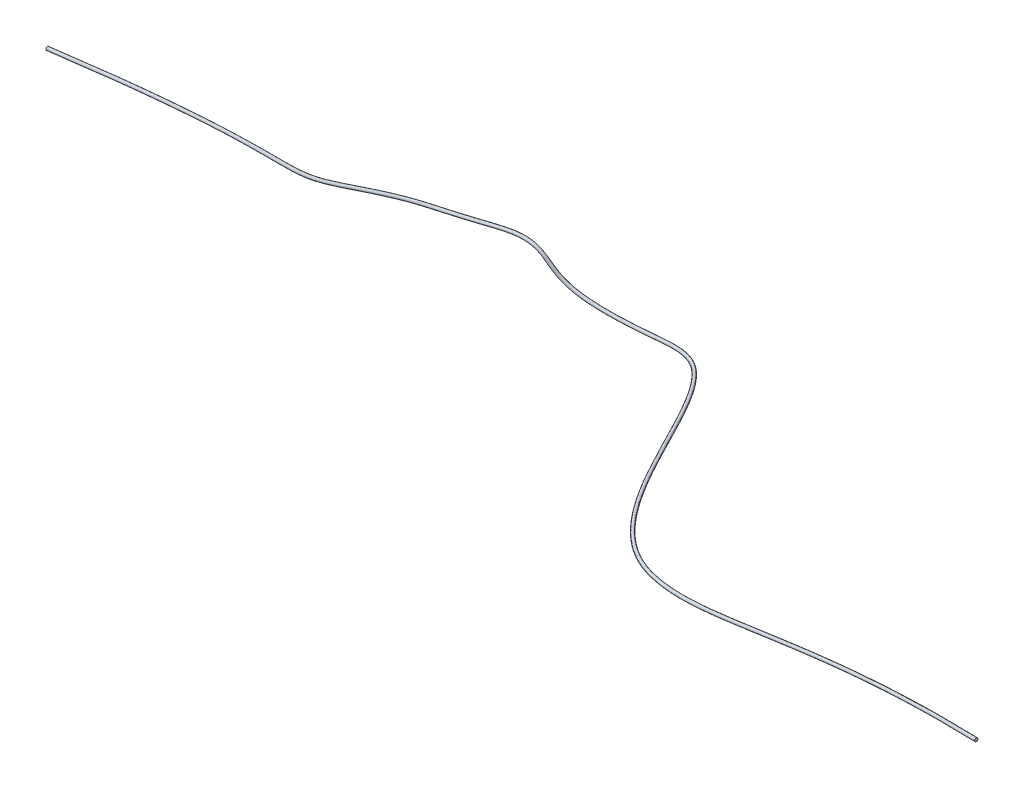
ISO-10303-21;
HEADER;
FILE_DESCRIPTION(('STEP AP214'),'2;1');
FILE_NAME('part.step','',(''),(''),'','','');
FILE_SCHEMA(('AUTOMOTIVE_DESIGN { 1 0 10303 214 1 1 1 1 }'));
ENDSEC;
DATA;
#1=APPLICATION_CONTEXT('core data for automotive mechanical design processes');
#2=APPLICATION_PROTOCOL_DEFINITION('international standard','automotive_design',2000,#1);
#3=PRODUCT_CONTEXT('',#1,'mechanical');
#4=PRODUCT('Part','Part','',(#3));
#5=PRODUCT_RELATED_PRODUCT_CATEGORY('part','',(#4));
#6=PRODUCT_DEFINITION_FORMATION('','',#4);
#7=PRODUCT_DEFINITION_CONTEXT('part definition',#1,'design');
#8=PRODUCT_DEFINITION('design','',#6,#7);
#9=PRODUCT_DEFINITION_SHAPE('','',#8);
#10=(LENGTH_UNIT() NAMED_UNIT(*) SI_UNIT(.MILLI.,.METRE.));
#11=(NAMED_UNIT(*) PLANE_ANGLE_UNIT() SI_UNIT($,.RADIAN.));
#12=(NAMED_UNIT(*) SI_UNIT($,.STERADIAN.) SOLID_ANGLE_UNIT());
#13=UNCERTAINTY_MEASURE_WITH_UNIT(LENGTH_MEASURE(1.E-05),#10,'distance_accuracy_value','');
#14=(GEOMETRIC_REPRESENTATION_CONTEXT(3) GLOBAL_UNCERTAINTY_ASSIGNED_CONTEXT((#13)) GLOBAL_UNIT_ASSIGNED_CONTEXT((#10,
#11,#12)) REPRESENTATION_CONTEXT('',''));
#15=CARTESIAN_POINT('',(0.,0.,0.));
#16=DIRECTION('',(0.,0.,1.));
#17=DIRECTION('',(1.,0.,0.));
#18=AXIS2_PLACEMENT_3D('',#15,#16,#17);
#19=CARTESIAN_POINT('',(0.0577607720607765,0.,0.243235879777106));
#20=DIRECTION('',(-0.970136098896678,0.0759121653718737,0.230376415385968));
#21=DIRECTION('',(0.231043088243106,0.,0.972943519108426));
#22=AXIS2_PLACEMENT_3D('',#19,#20,#21);
#23=PLANE('',#22);
#24=CARTESIAN_POINT('',(0.,0.,0.));
#25=DIRECTION('',(0.970136098896678,-0.0759121653718736,-0.230376415385968));
#26=DIRECTION('',(-0.231043088243106,0.,-0.972943519108426));
#27=AXIS2_PLACEMENT_3D('',#24,#25,#26);
#28=CIRCLE('',#27,0.25);
#29=CARTESIAN_POINT('',(-0.0577607720607765,0.,-0.243235879777106));
#30=VERTEX_POINT('',#29);
#31=EDGE_CURVE('E51',#30,#30,#28,.T.);
#32=ORIENTED_EDGE('',*,*,#31,.F.);
#33=EDGE_LOOP('',(#32));
#34=FACE_BOUND('',#33,.T.);
#35=ADVANCED_FACE('F47',(#34),#23,.T.);
#36=CARTESIAN_POINT('',(153.394156132668,-10.9843707983072,10.0933429930186));
#37=DIRECTION('',(-0.997897441630285,-0.0279046735619622,-0.058498078439647));
#38=DIRECTION('',(-0.0585208671221338,0.,0.998286185475525));
#39=AXIS2_PLACEMENT_3D('',#36,#37,#38);
#40=PLANE('',#39);
#41=CARTESIAN_POINT('',(153.395649871753,-10.7695909772429,9.9654078641168));
#42=DIRECTION('',(-0.997897441630286,-0.0279046735619622,-0.058498078439647));
#43=DIRECTION('',(-0.0585208671221338,0.,0.998286185475525));
#44=AXIS2_PLACEMENT_3D('',#41,#42,#43);
#45=CIRCLE('',#44,0.25);
#46=CARTESIAN_POINT('',(153.381019654973,-10.7695909772429,10.2149794104857));
#47=VERTEX_POINT('',#46);
#48=EDGE_CURVE('E11',#47,#47,#45,.T.);
#49=ORIENTED_EDGE('',*,*,#48,.F.);
#50=EDGE_LOOP('',(#49));
#51=FACE_BOUND('',#50,.T.);
#52=ADVANCED_FACE('F49',(#51),#40,.F.);
#53=CARTESIAN_POINT('',(-0.0577607720607765,0.,-0.243235879777106));
#54=CARTESIAN_POINT('',(6.45878838175014,-0.499880363927215,-1.79247331755684));
#55=CARTESIAN_POINT('',(16.6014105210175,-1.4942979671369,-4.11833407375674));
#56=CARTESIAN_POINT('',(28.3462962653859,-3.20738886149051,-6.60727280442785));
#57=CARTESIAN_POINT('',(30.8896640583218,-4.37760306911311,-7.31804389045089));
#58=CARTESIAN_POINT('',(34.0446964993133,-5.09036778912606,-8.94653199280111));
#59=CARTESIAN_POINT('',(36.1650490490448,-5.24438026406108,-10.2702513566765));
#60=CARTESIAN_POINT('',(39.2746408392147,-5.55407273055444,-12.2766585762137));
#61=CARTESIAN_POINT('',(41.2572454666078,-5.8588438783671,-13.6121514200171));
#62=CARTESIAN_POINT('',(43.2102682108326,-6.25924652844076,-14.7063108795634));
#63=CARTESIAN_POINT('',(45.1528286886776,-6.35388971310932,-15.3568873537207));
#64=CARTESIAN_POINT('',(47.6894249034441,-6.28745458005761,-15.9017421175981));
#65=CARTESIAN_POINT('',(50.7098420193957,-5.97348610860436,-16.4302418337879));
#66=CARTESIAN_POINT('',(53.3697320747002,-5.6317697446533,-16.8744872664419));
#67=CARTESIAN_POINT('',(54.8163472302238,-5.55484120893506,-17.1227292851218));
#68=CARTESIAN_POINT('',(55.5492919594778,-5.57068267741669,-17.2521859084911));
#69=CARTESIAN_POINT('',(56.2165447277572,-5.63177275142349,-17.3734458187258));
#70=CARTESIAN_POINT('',(56.9273168969393,-5.77938771716405,-17.5090516336717));
#71=CARTESIAN_POINT('',(58.296946253723,-6.32918840296866,-17.7955234538064));
#72=CARTESIAN_POINT('',(59.0201348638921,-7.01735091959234,-17.9733051072205));
#73=CARTESIAN_POINT('',(59.7736054025902,-7.92924128723453,-18.2188891721859));
#74=CARTESIAN_POINT('',(60.0876179032983,-8.40563195598929,-18.3543644532404));
#75=CARTESIAN_POINT('',(60.7945416240185,-9.28195255302844,-18.6388394188896));
#76=CARTESIAN_POINT('',(61.5887183944627,-9.9789640420526,-18.9116887598417));
#77=CARTESIAN_POINT('',(62.8938183455601,-10.7504319710075,-19.3013655331489));
#78=CARTESIAN_POINT('',(64.2700599577064,-11.293194804197,-19.641761122574));
#79=CARTESIAN_POINT('',(66.0348309176362,-11.7461142915373,-20.0061816016343));
#80=CARTESIAN_POINT('',(68.0872049885255,-12.0659636977657,-20.3597642613271));
#81=CARTESIAN_POINT('',(70.36135576753,-12.2728002645725,-20.6973154530245));
#82=CARTESIAN_POINT('',(72.0794634066687,-12.3525541234051,-20.9192929471287));
#83=CARTESIAN_POINT('',(73.8279904245098,-12.4019162983079,-21.1360497121873));
#84=CARTESIAN_POINT('',(75.7108027186144,-12.4276067737056,-21.3590996444943));
#85=CARTESIAN_POINT('',(77.8428262239037,-12.4188392947474,-21.1177971314962));
#86=CARTESIAN_POINT('',(79.2187743945239,-12.427873868258,-20.4724205352061));
#87=CARTESIAN_POINT('',(80.0473548263788,-12.4368346122433,-19.9545909737948));
#88=CARTESIAN_POINT('',(80.9774296433403,-12.4516525699776,-19.1745644464751));
#89=CARTESIAN_POINT('',(82.1202801532077,-12.4775310605994,-17.8750745489771));
#90=CARTESIAN_POINT('',(83.2258707428155,-12.5095610303557,-16.3199356362156));
#91=CARTESIAN_POINT('',(85.3648864588628,-12.5827605215081,-12.8201746809854));
#92=CARTESIAN_POINT('',(88.1617965365295,-12.7114168544118,-7.0120070290527));
#93=CARTESIAN_POINT('',(92.1185024203641,-12.8795127139677,0.453457506541938));
#94=CARTESIAN_POINT('',(95.728710076884,-12.9963895139614,5.39531558279754));
#95=CARTESIAN_POINT('',(98.5298877799888,-13.0658346643746,7.77966077833291));
#96=CARTESIAN_POINT('',(100.717005140519,-13.0998956040668,9.18852422052815));
#97=CARTESIAN_POINT('',(102.1482411717,-13.1079848532039,9.84539709226093));
#98=CARTESIAN_POINT('',(103.534201907112,-13.1118050644943,10.2278279845731));
#99=CARTESIAN_POINT('',(104.682073977787,-13.1116806833564,10.5226820559079));
#100=CARTESIAN_POINT('',(106.250232434624,-13.0947710404488,10.8122249158094));
#101=CARTESIAN_POINT('',(110.785523481581,-12.9547888571745,11.2430250245779));
#102=CARTESIAN_POINT('',(118.161636066218,-12.4498364933321,10.7402651630797));
#103=CARTESIAN_POINT('',(132.180940740219,-11.3961399897559,9.45946671396623));
#104=CARTESIAN_POINT('',(145.446438004091,-10.775618418438,9.37464986046103));
#105=CARTESIAN_POINT('',(153.397143610838,-10.5548111561785,9.83747273521505));
#106=CARTESIAN_POINT('',(-0.0208316474007508,0.498557254271902,-0.252005370338476));
#107=CARTESIAN_POINT('',(6.50698194476197,0.00157248403255344,-1.78354020257608));
#108=CARTESIAN_POINT('',(16.6721329607329,-0.987053931801395,-4.0739957476917));
#109=CARTESIAN_POINT('',(28.5063508339026,-2.83827977955314,-6.25224359148855));
#110=CARTESIAN_POINT('',(31.0905513470382,-3.98165262749174,-7.08055984388006));
#111=CARTESIAN_POINT('',(34.2472458082991,-4.67917498832223,-8.75295047635303));
#112=CARTESIAN_POINT('',(36.3544988198394,-4.83074384757825,-10.0695238778762));
#113=CARTESIAN_POINT('',(39.4641980997049,-5.1532407726434,-12.040698670839));
#114=CARTESIAN_POINT('',(41.5034994921079,-5.49498790779137,-13.334278276667));
#115=CARTESIAN_POINT('',(43.2862032788121,-5.76065392062704,-14.6191806237963));
#116=CARTESIAN_POINT('',(45.1535297457526,-5.85510196312535,-15.290534123693));
#117=CARTESIAN_POINT('',(47.6367908131393,-5.79307763174764,-15.9746210908507));
#118=CARTESIAN_POINT('',(50.6264209823539,-5.48249200490796,-16.5008009996913));
#119=CARTESIAN_POINT('',(53.309516094615,-5.13852093652436,-16.9305168924285));
#120=CARTESIAN_POINT('',(54.7937319727913,-5.0576655351797,-17.1763659314035));
#121=CARTESIAN_POINT('',(55.5659005775007,-5.07410046407564,-17.3109986017893));
#122=CARTESIAN_POINT('',(56.2796092855287,-5.13898050540637,-17.4386725314738));
#123=CARTESIAN_POINT('',(57.053550517321,-5.29910543898317,-17.5798177814674));
#124=CARTESIAN_POINT('',(58.5792925342405,-5.90453935902592,-17.9101678825314));
#125=CARTESIAN_POINT('',(59.3944019505158,-6.71752616796506,-17.8871215365681));
#126=CARTESIAN_POINT('',(60.1949662369332,-7.68496617460601,-18.0470453166935));
#127=CARTESIAN_POINT('',(60.5008239084634,-8.14269852985124,-18.2152182181828));
#128=CARTESIAN_POINT('',(61.1652135340042,-8.98141381142423,-18.5082444599017));
#129=CARTESIAN_POINT('',(61.9068102817557,-9.67654743766845,-18.65623374802));
#130=CARTESIAN_POINT('',(63.1330191921053,-10.4176832844175,-19.0135328084337));
#131=CARTESIAN_POINT('',(64.4505951736625,-10.9526192154016,-19.3209956912816));
#132=CARTESIAN_POINT('',(66.1670039071864,-11.4053587395399,-19.664037339463));
#133=CARTESIAN_POINT('',(68.185805207841,-11.7315778830892,-20.0009212211818));
#134=CARTESIAN_POINT('',(70.4343457605594,-11.9440093592368,-20.3273141360431));
#135=CARTESIAN_POINT('',(72.1433763703359,-12.0341619943383,-20.5394889921646));
#136=CARTESIAN_POINT('',(73.8760042212901,-12.0815135658584,-20.7545307980852));
#137=CARTESIAN_POINT('',(75.7309815446768,-12.0995365226367,-20.9795922290188));
#138=CARTESIAN_POINT('',(77.7478625860792,-12.1220852858153,-20.7172652563948));
#139=CARTESIAN_POINT('',(79.028586182954,-12.1338907597944,-20.1150058514493));
#140=CARTESIAN_POINT('',(79.8051131099414,-12.1428791947165,-19.6283587966575));
#141=CARTESIAN_POINT('',(80.6933732576878,-12.1568253859171,-18.885725326945));
#142=CARTESIAN_POINT('',(81.8040506801766,-12.182302203744,-17.6233065285365));
#143=CARTESIAN_POINT('',(82.8905244036027,-12.2140212874416,-16.095355261276));
#144=CARTESIAN_POINT('',(85.0061680191779,-12.2883415331442,-12.6318866745537));
#145=CARTESIAN_POINT('',(87.8033076598548,-12.413309189577,-6.83277523185717));
#146=CARTESIAN_POINT('',(91.7685084495539,-12.590207256472,0.666813776060485));
#147=CARTESIAN_POINT('',(95.4177189306268,-12.719585006542,5.67429373195811));
#148=CARTESIAN_POINT('',(98.2831819258058,-12.7688078639153,8.10339158496531));
#149=CARTESIAN_POINT('',(100.528239050278,-12.8233451346344,9.56063572259055));
#150=CARTESIAN_POINT('',(102.001664228077,-12.8721143372834,10.2591062597252));
#151=CARTESIAN_POINT('',(103.419815971904,-12.9031657075963,10.6667902237757));
#152=CARTESIAN_POINT('',(104.592923301591,-12.9231866374075,10.9799176533674));
#153=CARTESIAN_POINT('',(106.187259260974,-12.9186618208816,11.2789813054514));
#154=CARTESIAN_POINT('',(110.777226558432,-12.7756053862532,11.7079127438109));
#155=CARTESIAN_POINT('',(118.189902459585,-12.1713377381368,11.1598678711068));
#156=CARTESIAN_POINT('',(132.18741237716,-11.1571655885709,9.89836961634992));
#157=CARTESIAN_POINT('',(145.427082956633,-10.5256222597872,9.80666623012544));
#158=CARTESIAN_POINT('',(153.36487522118,-10.2993041187948,10.2660458385198));
#159=CARTESIAN_POINT('',(0.0946898967208022,0.498557254271902,0.234466389215737));
#160=CARTESIAN_POINT('',(6.62101672438055,-0.0183771685929523,-1.29318612764074));
#161=CARTESIAN_POINT('',(16.7831942113455,-1.04690288967791,-3.5758770419941));
#162=CARTESIAN_POINT('',(28.5041063873947,-3.20807118640788,-5.8651460883077));
#163=CARTESIAN_POINT('',(31.1834722025197,-4.27279655601991,-6.67803163461776));
#164=CARTESIAN_POINT('',(34.4134359014891,-4.94069337051228,-8.36320969365824));
#165=CARTESIAN_POINT('',(36.5481262223797,-5.09746257050476,-9.69722485411572));
#166=CARTESIAN_POINT('',(39.6702191833182,-5.45610840838744,-11.6964984567093));
#167=CARTESIAN_POINT('',(41.6652995941727,-5.85801009591359,-12.9988840019737));
#168=CARTESIAN_POINT('',(43.4800487788455,-5.86727782811666,-14.1580952671061));
#169=CARTESIAN_POINT('',(45.2767826252701,-5.91793696076121,-14.8061476185073));
#170=CARTESIAN_POINT('',(47.7222416134267,-5.71179627077171,-15.4861597683115));
#171=CARTESIAN_POINT('',(50.6985731599576,-5.3995722540804,-16.0110707482726));
#172=CARTESIAN_POINT('',(53.3852578049968,-5.07361876705282,-16.4406581064756));
#173=CARTESIAN_POINT('',(54.8768066931704,-5.00076743880312,-16.6866133903219));
#174=CARTESIAN_POINT('',(55.6565254697505,-5.01924495947971,-16.8222578663802));
#175=CARTESIAN_POINT('',(56.3784456141492,-5.08675169475957,-16.9512725590822));
#176=CARTESIAN_POINT('',(57.1612723348519,-5.25447082012235,-17.0942155209741));
#177=CARTESIAN_POINT('',(58.7309125246338,-5.86798240970445,-17.4276982052854));
#178=CARTESIAN_POINT('',(59.3808241072121,-6.8357414314329,-17.4142440112926));
#179=CARTESIAN_POINT('',(60.1163875901607,-7.87932400814059,-17.5766585392622));
#180=CARTESIAN_POINT('',(60.4546679034375,-8.32155768857565,-17.7419926916508));
#181=CARTESIAN_POINT('',(61.151063792083,-9.16511266751485,-18.0491911964565));
#182=CARTESIAN_POINT('',(61.8306936650667,-9.95330285575019,-18.2406334126173));
#183=CARTESIAN_POINT('',(63.0913064969169,-10.7276088906046,-18.6236685168149));
#184=CARTESIAN_POINT('',(64.4270690657798,-11.2895824883289,-18.9515417683068));
#185=CARTESIAN_POINT('',(66.1630287417702,-11.759506880672,-19.3107696627564));
#186=CARTESIAN_POINT('',(68.1962567619822,-12.0989777918958,-19.6618584393988));
#187=CARTESIAN_POINT('',(70.4536621213247,-12.3195542214462,-19.9974004960891));
#188=CARTESIAN_POINT('',(72.1720508124912,-12.4191588624825,-20.2221231024573));
#189=CARTESIAN_POINT('',(73.9031486757139,-12.4653857557595,-20.4348270098601));
#190=CARTESIAN_POINT('',(75.7436993684409,-12.4773094281727,-20.6505261264043));
#191=CARTESIAN_POINT('',(77.6743754527358,-12.5245834693233,-20.4223704812448));
#192=CARTESIAN_POINT('',(78.8855638632615,-12.538352713749,-19.8576466954933));
#193=CARTESIAN_POINT('',(79.6236765580364,-12.5472792371648,-19.3952482278205));
#194=CARTESIAN_POINT('',(80.4797581534961,-12.5606037470348,-18.6808743462722));
#195=CARTESIAN_POINT('',(81.5665119478495,-12.5857540650881,-17.4469323450565));
#196=CARTESIAN_POINT('',(82.6387581126688,-12.6172321983602,-15.9398698898879));
#197=CARTESIAN_POINT('',(84.7393102896566,-12.6923625248282,-12.505390645674));
#198=CARTESIAN_POINT('',(87.5305624289089,-12.8144505127341,-6.71146814355241));
#199=CARTESIAN_POINT('',(91.5168781305239,-12.9983746042154,0.809673094791617));
#200=CARTESIAN_POINT('',(95.1962714000919,-13.1347298200833,5.84768453431326));
#201=CARTESIAN_POINT('',(98.0998246401613,-13.1728355382683,8.3381662189757));
#202=CARTESIAN_POINT('',(100.394094609285,-13.2392821240691,9.80386033186013));
#203=CARTESIAN_POINT('',(101.913189367636,-13.3113151214055,10.4779795700349));
#204=CARTESIAN_POINT('',(103.363499357098,-13.3570680441747,10.8675027379262));
#205=CARTESIAN_POINT('',(104.56108455058,-13.3877359713463,11.1669121964908));
#206=CARTESIAN_POINT('',(106.175930903007,-13.3882553605801,11.4564175324328));
#207=CARTESIAN_POINT('',(110.803324609548,-13.2396297831443,11.8876424209233));
#208=CARTESIAN_POINT('',(118.254330616854,-12.5896146001403,11.4338770107052));
#209=CARTESIAN_POINT('',(132.225507896473,-11.5947086633453,10.1370996867871));
#210=CARTESIAN_POINT('',(145.437789810958,-10.9578430461311,10.0568230921402));
#211=CARTESIAN_POINT('',(153.361887743011,-10.7288637609235,10.5219160963233));
#212=CARTESIAN_POINT('',(0.0577607720607765,0.,0.243235879777106));
#213=CARTESIAN_POINT('',(6.57282316136871,-0.519830016552721,-1.3021192426215));
#214=CARTESIAN_POINT('',(16.7124717716301,-1.55414692501341,-3.62021536805914));
#215=CARTESIAN_POINT('',(28.344051818878,-3.57718026834524,-6.220175301247));
#216=CARTESIAN_POINT('',(30.9825849138034,-4.66874699764128,-6.91551568118859));
#217=CARTESIAN_POINT('',(34.2108865925033,-5.35188617131611,-8.55679121010632));
#218=CARTESIAN_POINT('',(36.3586764515851,-5.5110989869876,-9.89795233291601));
#219=CARTESIAN_POINT('',(39.4806619228281,-5.85694036629849,-11.9324583620839));
#220=CARTESIAN_POINT('',(41.4190455686726,-6.22186606648931,-13.2767571453237));
#221=CARTESIAN_POINT('',(43.404113710866,-6.36587043593038,-14.2452255228732));
#222=CARTESIAN_POINT('',(45.2760815681951,-6.41672471074519,-14.8725008485351));
#223=CARTESIAN_POINT('',(47.7748757037315,-6.20617321908168,-15.4132807950589));
#224=CARTESIAN_POINT('',(50.7819941969993,-5.89056635777679,-15.9405115823692));
#225=CARTESIAN_POINT('',(53.4454737850819,-5.56686757518176,-16.384628480489));
#226=CARTESIAN_POINT('',(54.8994219506029,-5.49794311255848,-16.6329767440402));
#227=CARTESIAN_POINT('',(55.6399168517276,-5.51582717282076,-16.7634451730821));
#228=CARTESIAN_POINT('',(56.3153810563778,-5.57954394077668,-16.8860458463342));
#229=CARTESIAN_POINT('',(57.0350387144702,-5.73475309830323,-17.0234493731784));
#230=CARTESIAN_POINT('',(58.4485662441163,-6.29263145364719,-17.3130537765604));
#231=CARTESIAN_POINT('',(59.0065570205884,-7.13556618306017,-17.5004275819449));
#232=CARTESIAN_POINT('',(59.6950267558177,-8.12359912076911,-17.7485023947545));
#233=CARTESIAN_POINT('',(60.0414618982724,-8.58449111471371,-17.8811389267084));
#234=CARTESIAN_POINT('',(60.7803918820973,-9.46565140911907,-18.1797861554444));
#235=CARTESIAN_POINT('',(61.5126017777737,-10.2557194601343,-18.4960884244391));
#236=CARTESIAN_POINT('',(62.8521056503716,-11.0603575771947,-18.9115012415301));
#237=CARTESIAN_POINT('',(64.2465338498237,-11.6301580771243,-19.2723071995992));
#238=CARTESIAN_POINT('',(66.03085575222,-12.1002624326693,-19.6529139249277));
#239=CARTESIAN_POINT('',(68.0976565426667,-12.4333636065723,-20.0207014795441));
#240=CARTESIAN_POINT('',(70.3806721282953,-12.6483451267819,-20.3674018130705));
#241=CARTESIAN_POINT('',(72.108137848824,-12.7375509915493,-20.6019270574214));
#242=CARTESIAN_POINT('',(73.8551348789336,-12.785788488209,-20.8163459239622));
#243=CARTESIAN_POINT('',(75.7235205423786,-12.8053796792416,-21.0300335418798));
#244=CARTESIAN_POINT('',(77.7693390905604,-12.8213374782554,-20.8229023563461));
#245=CARTESIAN_POINT('',(79.0757520748314,-12.8323358222125,-20.2150613792501));
#246=CARTESIAN_POINT('',(79.8659182744738,-12.8412346546917,-19.7214804049577));
#247=CARTESIAN_POINT('',(80.7638145391485,-12.8554309310953,-18.9697134658024));
#248=CARTESIAN_POINT('',(81.8827414208807,-12.8809829219435,-17.6987003654971));
#249=CARTESIAN_POINT('',(82.9741044518815,-12.9127719412742,-16.1644502648275));
#250=CARTESIAN_POINT('',(85.0980287293416,-12.9867815131922,-12.6936786521057));
#251=CARTESIAN_POINT('',(87.8890513055836,-13.1125581775688,-6.89069994074795));
#252=CARTESIAN_POINT('',(91.8668721013341,-13.2876800617111,0.59631682527307));
#253=CARTESIAN_POINT('',(95.5072625463491,-13.4115343275026,5.5687063851527));
#254=CARTESIAN_POINT('',(98.3465304943443,-13.4698623387276,8.01443541234329));
#255=CARTESIAN_POINT('',(100.582860699526,-13.5158325935016,9.43174882979773));
#256=CARTESIAN_POINT('',(102.059766311259,-13.5471856373261,10.0642704025706));
#257=CARTESIAN_POINT('',(103.477885292307,-13.5657074010727,10.4285404987236));
#258=CARTESIAN_POINT('',(104.650235226775,-13.5762300172952,10.7096765990314));
#259=CARTESIAN_POINT('',(106.238904076657,-13.5643645801473,10.9896611427907));
#260=CARTESIAN_POINT('',(110.811621532698,-13.4188132540656,11.4227547016903));
#261=CARTESIAN_POINT('',(118.226064223487,-12.8681133553356,11.0142743026781));
#262=CARTESIAN_POINT('',(132.219036259532,-11.8336830645304,9.69819678440344));
#263=CARTESIAN_POINT('',(145.457144858416,-11.207839204782,9.62480672247577));
#264=CARTESIAN_POINT('',(153.394156132668,-10.9843707983072,10.0933429930186));
#265=CARTESIAN_POINT('',(0.0208316474007508,-0.498557254271902,0.252005370338476));
#266=CARTESIAN_POINT('',(6.52462959835688,-1.02128286451249,-1.31105235760227));
#267=CARTESIAN_POINT('',(16.6417493319146,-2.06139096034892,-3.66455369412417));
#268=CARTESIAN_POINT('',(28.1839972503613,-3.94628935028261,-6.57520451418631));
#269=CARTESIAN_POINT('',(30.7816976250871,-5.06469743926266,-7.15299972775942));
#270=CARTESIAN_POINT('',(34.0083372835175,-5.76307897211994,-8.7503727265544));
#271=CARTESIAN_POINT('',(36.1692266807906,-5.92473540347044,-10.0986798117163));
#272=CARTESIAN_POINT('',(39.291104662338,-6.25777232420953,-12.1684182674586));
#273=CARTESIAN_POINT('',(41.1727915431724,-6.58572203706504,-13.5546302886738));
#274=CARTESIAN_POINT('',(43.3281786428865,-6.8644630437441,-14.3323557786403));
#275=CARTESIAN_POINT('',(45.2753805111201,-6.91551246072917,-14.9388540785628));
#276=CARTESIAN_POINT('',(47.8275097940362,-6.70055016739164,-15.3404018218063));
#277=CARTESIAN_POINT('',(50.865415234041,-6.38156046147317,-15.8699524164658));
#278=CARTESIAN_POINT('',(53.5056897651671,-6.0601163833107,-16.3285988545024));
#279=CARTESIAN_POINT('',(54.9220372080354,-5.99511878631384,-16.5793400977584));
#280=CARTESIAN_POINT('',(55.6233082337046,-6.01240938616181,-16.7046324797839));
#281=CARTESIAN_POINT('',(56.2523164986063,-6.0723361867938,-16.8208191335862));
#282=CARTESIAN_POINT('',(56.9088050940884,-6.21503537648411,-16.9526832253827));
#283=CARTESIAN_POINT('',(58.1662199635988,-6.71728049758993,-17.1984093478355));
#284=CARTESIAN_POINT('',(58.6322899339647,-7.43539093468745,-17.5866111525973));
#285=CARTESIAN_POINT('',(59.2736659214746,-8.36787423339762,-17.9203462502468));
#286=CARTESIAN_POINT('',(59.6282558931073,-8.84742454085176,-18.020285161766));
#287=CARTESIAN_POINT('',(60.4097199721116,-9.76619015072328,-18.3103811144322));
#288=CARTESIAN_POINT('',(61.1945098904808,-10.5581360645185,-18.7515434362608));
#289=CARTESIAN_POINT('',(62.6129048038264,-11.3931062637848,-19.1993339662453));
#290=CARTESIAN_POINT('',(64.0659986338675,-11.9707336659197,-19.5930726308916));
#291=CARTESIAN_POINT('',(65.8986827626699,-12.4410179846667,-19.9950581870991));
#292=CARTESIAN_POINT('',(67.9990563233512,-12.7677494212488,-20.3795445196895));
#293=CARTESIAN_POINT('',(70.3076821352659,-12.9771360321176,-20.737403130052));
#294=CARTESIAN_POINT('',(72.0442248851568,-13.0559431206162,-20.9817310123856));
#295=CARTESIAN_POINT('',(73.8071210821532,-13.1061912206586,-21.1978648380642));
#296=CARTESIAN_POINT('',(75.7033417163162,-13.1334499303105,-21.4095409573553));
#297=CARTESIAN_POINT('',(77.8643027283849,-13.1180914871876,-21.2234342314475));
#298=CARTESIAN_POINT('',(79.2659402864013,-13.126318930676,-20.5724760630068));
#299=CARTESIAN_POINT('',(80.1081599909111,-13.1351900722185,-20.047712582095));
#300=CARTESIAN_POINT('',(81.0478709248009,-13.1502581151558,-19.2585525853326));
#301=CARTESIAN_POINT('',(82.1989708939118,-13.1762117787988,-17.9504683859377));
#302=CARTESIAN_POINT('',(83.3094507910943,-13.2083116841883,-16.3890306397671));
#303=CARTESIAN_POINT('',(85.4567471690263,-13.2812005015562,-12.8819666585374));
#304=CARTESIAN_POINT('',(88.2475401822582,-13.4106658424036,-7.06993173794349));
#305=CARTESIAN_POINT('',(92.2168660721444,-13.5769855192069,0.382960555754522));
#306=CARTESIAN_POINT('',(95.8182536926062,-13.688338834922,5.28972823599213));
#307=CARTESIAN_POINT('',(98.5932363485273,-13.7668891391869,7.69070460571089));
#308=CARTESIAN_POINT('',(100.771626789768,-13.792383062934,9.05963732773533));
#309=CARTESIAN_POINT('',(102.206343254882,-13.7830561532466,9.65056123510631));
#310=CARTESIAN_POINT('',(103.592271227515,-13.7743467579707,9.98957825952101));
#311=CARTESIAN_POINT('',(104.739385902971,-13.7647240632441,10.2524410015719));
#312=CARTESIAN_POINT('',(106.301877250308,-13.7404737997145,10.5229047531487));
#313=CARTESIAN_POINT('',(110.819918455848,-13.5979967249869,10.9578669824574));
#314=CARTESIAN_POINT('',(118.19779783012,-13.1466121105309,10.594671594651));
#315=CARTESIAN_POINT('',(132.21256462259,-12.0726574657154,9.25929388201975));
#316=CARTESIAN_POINT('',(145.476499905874,-11.4578353634328,9.19279035281136));
#317=CARTESIAN_POINT('',(153.426424522326,-11.2398778356909,9.66476988971379));
#318=CARTESIAN_POINT('',(-0.0946898967208022,-0.498557254271902,-0.234466389215737));
#319=CARTESIAN_POINT('',(6.4105948187383,-1.00133321188698,-1.80140643253761));
#320=CARTESIAN_POINT('',(16.530688081302,-2.0015420024724,-4.16267239982177));
#321=CARTESIAN_POINT('',(28.1862416968693,-3.57649794342787,-6.96230201736716));
#322=CARTESIAN_POINT('',(30.6887767696055,-4.77355351073448,-7.55552793702172));
#323=CARTESIAN_POINT('',(33.8421471903275,-5.50156058992989,-9.1401135092492));
#324=CARTESIAN_POINT('',(35.9755992782502,-5.65801668054392,-10.4709788354768));
#325=CARTESIAN_POINT('',(39.0850835787246,-5.95490468846549,-12.5126184815884));
#326=CARTESIAN_POINT('',(41.0109914411077,-6.22269984894282,-13.8900245633672));
#327=CARTESIAN_POINT('',(43.134333142853,-6.75783913625448,-14.7934411353305));
#328=CARTESIAN_POINT('',(45.1521276316026,-6.8526774630933,-15.4232405837484));
#329=CARTESIAN_POINT('',(47.7420589937489,-6.78183152836758,-15.8288631443455));
#330=CARTESIAN_POINT('',(50.7932630564374,-6.46448021230074,-16.3596826678845));
#331=CARTESIAN_POINT('',(53.4299480547853,-6.12501855278224,-16.8184576404553));
#332=CARTESIAN_POINT('',(54.8389624876563,-6.05201688269042,-17.06909263884));
#333=CARTESIAN_POINT('',(55.5326833414548,-6.06726489075773,-17.193373215193));
#334=CARTESIAN_POINT('',(56.1534801699857,-6.1245649974406,-17.3082191059779));
#335=CARTESIAN_POINT('',(56.8010832765576,-6.25966999534493,-17.438285485876));
#336=CARTESIAN_POINT('',(58.0145999732055,-6.7538374469114,-17.6808790250815));
#337=CARTESIAN_POINT('',(58.6458677772683,-7.31717567121961,-18.0594886778729));
#338=CARTESIAN_POINT('',(59.3522445682472,-8.17351639986304,-18.3907330276782));
#339=CARTESIAN_POINT('',(59.6744118981331,-8.66856538212734,-18.493510688298));
#340=CARTESIAN_POINT('',(60.4238697140328,-9.58249129463266,-18.7694343778775));
#341=CARTESIAN_POINT('',(61.2706265071697,-10.2813806464368,-19.1671437716634));
#342=CARTESIAN_POINT('',(62.6546174990149,-11.0831806575976,-19.5891982578641));
#343=CARTESIAN_POINT('',(64.0895247417502,-11.6337703929924,-19.9625265538664));
#344=CARTESIAN_POINT('',(65.9026579280861,-12.0868698435346,-20.3483258638056));
#345=CARTESIAN_POINT('',(67.98860476921,-12.4003495124423,-20.7186073014725));
#346=CARTESIAN_POINT('',(70.2883657745005,-12.6015911699082,-21.0673167700059));
#347=CARTESIAN_POINT('',(72.0155504430015,-12.6709462524719,-21.2990969020929));
#348=CARTESIAN_POINT('',(73.7799766277295,-12.7223190307574,-21.5175686262893));
#349=CARTESIAN_POINT('',(75.6906238925521,-12.7556770247745,-21.7386070599698));
#350=CARTESIAN_POINT('',(77.9377898617283,-12.7155933036795,-21.5183290065976));
#351=CARTESIAN_POINT('',(79.4089626060938,-12.7218569767215,-20.8298352189628));
#352=CARTESIAN_POINT('',(80.2895965428162,-12.7307900297701,-20.2808231509321));
#353=CARTESIAN_POINT('',(81.2614860289926,-12.7464797540381,-19.4634035660053));
#354=CARTESIAN_POINT('',(82.4365096262389,-12.7727599174547,-18.1268425694178));
#355=CARTESIAN_POINT('',(83.5612170820283,-12.8051007732697,-16.5445160111552));
#356=CARTESIAN_POINT('',(85.7236048985476,-12.8771795098721,-13.0084626874171));
#357=CARTESIAN_POINT('',(88.5202854132041,-13.0095245192466,-7.19123882624825));
#358=CARTESIAN_POINT('',(92.4684963911744,-13.1688181714635,0.240101237023392));
#359=CARTESIAN_POINT('',(96.0397012231412,-13.2731940213807,5.11633743363697));
#360=CARTESIAN_POINT('',(98.7765936341717,-13.3628614648339,7.45592997170051));
#361=CARTESIAN_POINT('',(100.905771230761,-13.3764460734992,8.81641271846575));
#362=CARTESIAN_POINT('',(102.294818115323,-13.3438553691245,9.43168792479665));
#363=CARTESIAN_POINT('',(103.648587842321,-13.3204444213923,9.78886574537056));
#364=CARTESIAN_POINT('',(104.771224653982,-13.3001747293053,10.0654464584485));
#365=CARTESIAN_POINT('',(106.313205608275,-13.270880260016,10.3454685261673));
#366=CARTESIAN_POINT('',(110.793820404731,-13.1339723280958,10.7781373053449));
#367=CARTESIAN_POINT('',(118.133369672851,-12.7283352485275,10.3206624550526));
#368=CARTESIAN_POINT('',(132.174469103277,-11.635114390941,9.02056381158254));
#369=CARTESIAN_POINT('',(145.465793051549,-11.0256145770888,8.94263349079662));
#370=CARTESIAN_POINT('',(153.429412000496,-10.8103181935622,9.40889963191027));
#371=CARTESIAN_POINT('',(-0.0577607720607765,0.,-0.243235879777106));
#372=CARTESIAN_POINT('',(6.45878838175014,-0.499880363927215,-1.79247331755684));
#373=CARTESIAN_POINT('',(16.6014105210175,-1.4942979671369,-4.11833407375674));
#374=CARTESIAN_POINT('',(28.3462962653859,-3.20738886149051,-6.60727280442785));
#375=CARTESIAN_POINT('',(30.8896640583218,-4.37760306911311,-7.31804389045089));
#376=CARTESIAN_POINT('',(34.0446964993133,-5.09036778912606,-8.94653199280111));
#377=CARTESIAN_POINT('',(36.1650490490448,-5.24438026406108,-10.2702513566765));
#378=CARTESIAN_POINT('',(39.2746408392147,-5.55407273055444,-12.2766585762137));
#379=CARTESIAN_POINT('',(41.2572454666078,-5.8588438783671,-13.6121514200171));
#380=CARTESIAN_POINT('',(43.2102682108326,-6.25924652844076,-14.7063108795634));
#381=CARTESIAN_POINT('',(45.1528286886776,-6.35388971310932,-15.3568873537207));
#382=CARTESIAN_POINT('',(47.6894249034441,-6.28745458005761,-15.9017421175981));
#383=CARTESIAN_POINT('',(50.7098420193957,-5.97348610860436,-16.4302418337879));
#384=CARTESIAN_POINT('',(53.3697320747002,-5.6317697446533,-16.8744872664419));
#385=CARTESIAN_POINT('',(54.8163472302238,-5.55484120893506,-17.1227292851218));
#386=CARTESIAN_POINT('',(55.5492919594778,-5.57068267741669,-17.2521859084911));
#387=CARTESIAN_POINT('',(56.2165447277572,-5.63177275142349,-17.3734458187258));
#388=CARTESIAN_POINT('',(56.9273168969393,-5.77938771716405,-17.5090516336717));
#389=CARTESIAN_POINT('',(58.296946253723,-6.32918840296866,-17.7955234538064));
#390=CARTESIAN_POINT('',(59.0201348638921,-7.01735091959234,-17.9733051072205));
#391=CARTESIAN_POINT('',(59.7736054025902,-7.92924128723453,-18.2188891721859));
#392=CARTESIAN_POINT('',(60.0876179032983,-8.40563195598929,-18.3543644532404));
#393=CARTESIAN_POINT('',(60.7945416240185,-9.28195255302844,-18.6388394188896));
#394=CARTESIAN_POINT('',(61.5887183944627,-9.9789640420526,-18.9116887598417));
#395=CARTESIAN_POINT('',(62.8938183455601,-10.7504319710075,-19.3013655331489));
#396=CARTESIAN_POINT('',(64.2700599577064,-11.293194804197,-19.641761122574));
#397=CARTESIAN_POINT('',(66.0348309176362,-11.7461142915373,-20.0061816016343));
#398=CARTESIAN_POINT('',(68.0872049885255,-12.0659636977657,-20.3597642613271));
#399=CARTESIAN_POINT('',(70.36135576753,-12.2728002645725,-20.6973154530245));
#400=CARTESIAN_POINT('',(72.0794634066687,-12.3525541234051,-20.9192929471287));
#401=CARTESIAN_POINT('',(73.8279904245098,-12.4019162983079,-21.1360497121873));
#402=CARTESIAN_POINT('',(75.7108027186144,-12.4276067737056,-21.3590996444943));
#403=CARTESIAN_POINT('',(77.8428262239037,-12.4188392947474,-21.1177971314962));
#404=CARTESIAN_POINT('',(79.2187743945239,-12.427873868258,-20.4724205352061));
#405=CARTESIAN_POINT('',(80.0473548263788,-12.4368346122433,-19.9545909737948));
#406=CARTESIAN_POINT('',(80.9774296433403,-12.4516525699776,-19.1745644464751));
#407=CARTESIAN_POINT('',(82.1202801532077,-12.4775310605994,-17.8750745489771));
#408=CARTESIAN_POINT('',(83.2258707428155,-12.5095610303557,-16.3199356362156));
#409=CARTESIAN_POINT('',(85.3648864588628,-12.5827605215081,-12.8201746809854));
#410=CARTESIAN_POINT('',(88.1617965365295,-12.7114168544118,-7.0120070290527));
#411=CARTESIAN_POINT('',(92.1185024203641,-12.8795127139677,0.453457506541938));
#412=CARTESIAN_POINT('',(95.728710076884,-12.9963895139614,5.39531558279754));
#413=CARTESIAN_POINT('',(98.5298877799888,-13.0658346643746,7.77966077833291));
#414=CARTESIAN_POINT('',(100.717005140519,-13.0998956040668,9.18852422052815));
#415=CARTESIAN_POINT('',(102.1482411717,-13.1079848532039,9.84539709226093));
#416=CARTESIAN_POINT('',(103.534201907112,-13.1118050644943,10.2278279845731));
#417=CARTESIAN_POINT('',(104.682073977787,-13.1116806833564,10.5226820559079));
#418=CARTESIAN_POINT('',(106.250232434624,-13.0947710404488,10.8122249158094));
#419=CARTESIAN_POINT('',(110.785523481581,-12.9547888571745,11.2430250245779));
#420=CARTESIAN_POINT('',(118.161636066218,-12.4498364933321,10.7402651630797));
#421=CARTESIAN_POINT('',(132.180940740219,-11.3961399897559,9.45946671396623));
#422=CARTESIAN_POINT('',(145.446438004091,-10.775618418438,9.37464986046103));
#423=CARTESIAN_POINT('',(153.397143610838,-10.5548111561785,9.83747273521505));
#424=(BOUNDED_SURFACE() B_SPLINE_SURFACE(3,3,((#53,#54,#55,#56,#57,#58,#59,#60,#61,#62,#63,#64,
#65,#66,#67,#68,#69,#70,#71,#72,#73,#74,#75,#76,#77,#78,#79,#80,#81,#82,#83,#84,#85,#86,#87,#88,
#89,#90,#91,#92,#93,#94,#95,#96,#97,#98,#99,#100,#101,#102,#103,#104,#105),(#106,#107,#108,#109,
#110,#111,#112,#113,#114,#115,#116,#117,#118,#119,#120,#121,#122,#123,#124,#125,#126,#127,#128,
#129,#130,#131,#132,#133,#134,#135,#136,#137,#138,#139,#140,#141,#142,#143,#144,#145,#146,#147,
#148,#149,#150,#151,#152,#153,#154,#155,#156,#157,#158),(#159,#160,#161,#162,#163,#164,#165,
#166,#167,#168,#169,#170,#171,#172,#173,#174,#175,#176,#177,#178,#179,#180,#181,#182,#183,#184,
#185,#186,#187,#188,#189,#190,#191,#192,#193,#194,#195,#196,#197,#198,#199,#200,#201,#202,#203,
#204,#205,#206,#207,#208,#209,#210,#211),(#212,#213,#214,#215,#216,#217,#218,#219,#220,#221,
#222,#223,#224,#225,#226,#227,#228,#229,#230,#231,#232,#233,#234,#235,#236,#237,#238,#239,#240,
#241,#242,#243,#244,#245,#246,#247,#248,#249,#250,#251,#252,#253,#254,#255,#256,#257,#258,#259,
#260,#261,#262,#263,#264),(#265,#266,#267,#268,#269,#270,#271,#272,#273,#274,#275,#276,#277,
#278,#279,#280,#281,#282,#283,#284,#285,#286,#287,#288,#289,#290,#291,#292,#293,#294,#295,#296,
#297,#298,#299,#300,#301,#302,#303,#304,#305,#306,#307,#308,#309,#310,#311,#312,#313,#314,#315,
#316,#317),(#318,#319,#320,#321,#322,#323,#324,#325,#326,#327,#328,#329,#330,#331,#332,#333,
#334,#335,#336,#337,#338,#339,#340,#341,#342,#343,#344,#345,#346,#347,#348,#349,#350,#351,#352,
#353,#354,#355,#356,#357,#358,#359,#360,#361,#362,#363,#364,#365,#366,#367,#368,#369,#370),
(#371,#372,#373,#374,#375,#376,#377,#378,#379,#380,#381,#382,#383,#384,#385,#386,#387,#388,#389,
#390,#391,#392,#393,#394,#395,#396,#397,#398,#399,#400,#401,#402,#403,#404,#405,#406,#407,#408,
#409,#410,#411,#412,#413,#414,#415,#416,#417,#418,#419,#420,#421,#422,#423)),.UNSPECIFIED.,.T.,
.F.,.F.) B_SPLINE_SURFACE_WITH_KNOTS((4,3,4),(4,1,1,1,1,1,1,1,1,1,1,1,1,1,1,1,1,1,1,1,1,1,1,1,1,
1,1,1,1,1,1,1,1,1,1,1,1,1,1,1,1,1,1,1,1,1,1,1,1,1,4),(0.,0.5,1.),(0.,0.03125,0.0625,0.125,
0.130933337495603,0.173694683408679,0.1875,0.25,0.289375000000127,0.32875,0.368125,
0.399400261828309,0.420099999999991,0.430309375,0.435825849485854,0.44051875,0.450728125,
0.4609375,0.500312499999998,0.501524972326579,0.531951628520309,0.5396875,0.5790625,
0.602265625000001,0.62546875,0.648671875,0.671875,0.689453125,0.70703125,0.709665755229426,
0.724609375,0.7421875,0.747448229363379,0.750062500000003,0.7579375,0.7658125,0.7736875,
0.7815625,0.8125,0.8359375,0.859375,0.871993895725884,0.875,0.887759583320721,0.889339417716908,
0.890625,0.900583207314788,0.90625,0.9375,0.96875,1.),
.UNSPECIFIED.) GEOMETRIC_REPRESENTATION_ITEM() RATIONAL_B_SPLINE_SURFACE(((1.,1.,1.,1.,1.,1.,1.,
1.,1.,1.,1.,1.,1.,1.,1.,1.,1.,1.,1.,1.,1.,1.,1.,1.,1.,1.,1.,1.,1.,1.,1.,1.,1.,1.,1.,1.,1.,1.,1.,
1.,1.,1.,1.,1.,1.,1.,1.,1.,1.,1.,1.,1.,1.),(0.333333333333333,0.333333333333333,
0.333333333333333,0.333333333333333,0.333333333333333,0.333333333333333,0.333333333333333,
0.333333333333333,0.333333333333333,0.333333333333333,0.333333333333333,0.333333333333333,
0.333333333333333,0.333333333333333,0.333333333333333,0.333333333333333,0.333333333333333,
0.333333333333333,0.333333333333333,0.333333333333333,0.333333333333333,0.333333333333333,
0.333333333333333,0.333333333333333,0.333333333333333,0.333333333333333,0.333333333333333,
0.333333333333333,0.333333333333333,0.333333333333333,0.333333333333333,0.333333333333333,
0.333333333333333,0.333333333333333,0.333333333333333,0.333333333333333,0.333333333333333,
0.333333333333333,0.333333333333333,0.333333333333333,0.333333333333333,0.333333333333333,
0.333333333333333,0.333333333333333,0.333333333333333,0.333333333333333,0.333333333333333,
0.333333333333333,0.333333333333333,0.333333333333333,0.333333333333333,0.333333333333333,
0.333333333333333),(0.333333333333333,0.333333333333333,0.333333333333333,0.333333333333333,
0.333333333333333,0.333333333333333,0.333333333333333,0.333333333333333,0.333333333333333,
0.333333333333333,0.333333333333333,0.333333333333333,0.333333333333333,0.333333333333333,
0.333333333333333,0.333333333333333,0.333333333333333,0.333333333333333,0.333333333333333,
0.333333333333333,0.333333333333333,0.333333333333333,0.333333333333333,0.333333333333333,
0.333333333333333,0.333333333333333,0.333333333333333,0.333333333333333,0.333333333333333,
0.333333333333333,0.333333333333333,0.333333333333333,0.333333333333333,0.333333333333333,
0.333333333333333,0.333333333333333,0.333333333333333,0.333333333333333,0.333333333333333,
0.333333333333333,0.333333333333333,0.333333333333333,0.333333333333333,0.333333333333333,
0.333333333333333,0.333333333333333,0.333333333333333,0.333333333333333,0.333333333333333,
0.333333333333333,0.333333333333333,0.333333333333333,0.333333333333333),(1.,1.,1.,1.,1.,1.,1.,
1.,1.,1.,1.,1.,1.,1.,1.,1.,1.,1.,1.,1.,1.,1.,1.,1.,1.,1.,1.,1.,1.,1.,1.,1.,1.,1.,1.,1.,1.,1.,1.,
1.,1.,1.,1.,1.,1.,1.,1.,1.,1.,1.,1.,1.,1.),(0.333333333333333,0.333333333333333,
0.333333333333333,0.333333333333333,0.333333333333333,0.333333333333333,0.333333333333333,
0.333333333333333,0.333333333333333,0.333333333333333,0.333333333333333,0.333333333333333,
0.333333333333333,0.333333333333333,0.333333333333333,0.333333333333333,0.333333333333333,
0.333333333333333,0.333333333333333,0.333333333333333,0.333333333333333,0.333333333333333,
0.333333333333333,0.333333333333333,0.333333333333333,0.333333333333333,0.333333333333333,
0.333333333333333,0.333333333333333,0.333333333333333,0.333333333333333,0.333333333333333,
0.333333333333333,0.333333333333333,0.333333333333333,0.333333333333333,0.333333333333333,
0.333333333333333,0.333333333333333,0.333333333333333,0.333333333333333,0.333333333333333,
0.333333333333333,0.333333333333333,0.333333333333333,0.333333333333333,0.333333333333333,
0.333333333333333,0.333333333333333,0.333333333333333,0.333333333333333,0.333333333333333,
0.333333333333333),(0.333333333333333,0.333333333333333,0.333333333333333,0.333333333333333,
0.333333333333333,0.333333333333333,0.333333333333333,0.333333333333333,0.333333333333333,
0.333333333333333,0.333333333333333,0.333333333333333,0.333333333333333,0.333333333333333,
0.333333333333333,0.333333333333333,0.333333333333333,0.333333333333333,0.333333333333333,
0.333333333333333,0.333333333333333,0.333333333333333,0.333333333333333,0.333333333333333,
0.333333333333333,0.333333333333333,0.333333333333333,0.333333333333333,0.333333333333333,
0.333333333333333,0.333333333333333,0.333333333333333,0.333333333333333,0.333333333333333,
0.333333333333333,0.333333333333333,0.333333333333333,0.333333333333333,0.333333333333333,
0.333333333333333,0.333333333333333,0.333333333333333,0.333333333333333,0.333333333333333,
0.333333333333333,0.333333333333333,0.333333333333333,0.333333333333333,0.333333333333333,
0.333333333333333,0.333333333333333,0.333333333333333,0.333333333333333),(1.,1.,1.,1.,1.,1.,1.,
1.,1.,1.,1.,1.,1.,1.,1.,1.,1.,1.,1.,1.,1.,1.,1.,1.,1.,1.,1.,1.,1.,1.,1.,1.,1.,1.,1.,1.,1.,1.,1.,
1.,1.,1.,1.,1.,1.,1.,1.,1.,1.,1.,1.,1.,1.))) REPRESENTATION_ITEM('') SURFACE());
#425=ORIENTED_EDGE('',*,*,#31,.T.);
#426=EDGE_LOOP('',(#425));
#427=FACE_BOUND('',#426,.T.);
#428=ORIENTED_EDGE('',*,*,#48,.T.);
#429=EDGE_LOOP('',(#428));
#430=FACE_BOUND('',#429,.T.);
#431=ADVANCED_FACE('F60',(#427,#430),#424,.T.);
#432=CLOSED_SHELL('',(#35,#52,#431));
#433=MANIFOLD_SOLID_BREP('B2',#432);
#434=ADVANCED_BREP_SHAPE_REPRESENTATION('',(#18,#433),#14);
#435=SHAPE_DEFINITION_REPRESENTATION(#9,#434);
ENDSEC;
END-ISO-10303-21;
